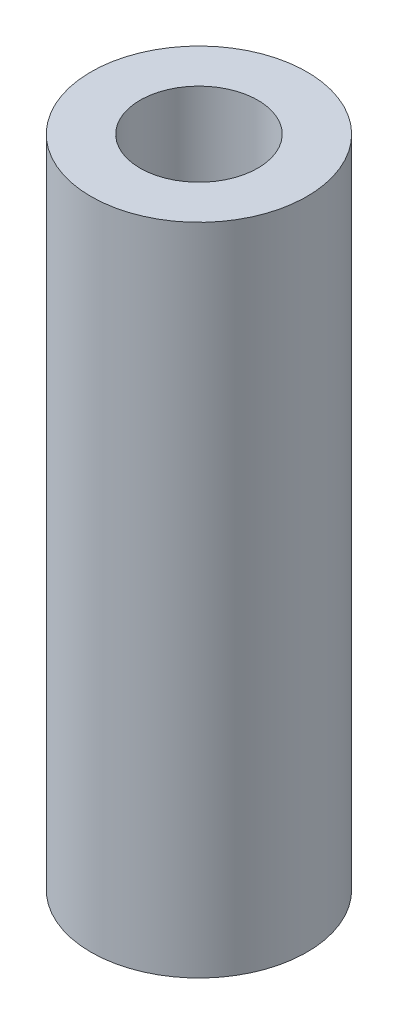
ISO-10303-21;
HEADER;
FILE_DESCRIPTION(('STEP AP214'),'2;1');
FILE_NAME('part.step','',(''),(''),'','','');
FILE_SCHEMA(('AUTOMOTIVE_DESIGN { 1 0 10303 214 1 1 1 1 }'));
ENDSEC;
DATA;
#1=APPLICATION_CONTEXT('core data for automotive mechanical design processes');
#2=APPLICATION_PROTOCOL_DEFINITION('international standard','automotive_design',2000,#1);
#3=PRODUCT_CONTEXT('',#1,'mechanical');
#4=PRODUCT('Part','Part','',(#3));
#5=PRODUCT_RELATED_PRODUCT_CATEGORY('part','',(#4));
#6=PRODUCT_DEFINITION_FORMATION('','',#4);
#7=PRODUCT_DEFINITION_CONTEXT('part definition',#1,'design');
#8=PRODUCT_DEFINITION('design','',#6,#7);
#9=PRODUCT_DEFINITION_SHAPE('','',#8);
#10=(LENGTH_UNIT() NAMED_UNIT(*) SI_UNIT(.MILLI.,.METRE.));
#11=(NAMED_UNIT(*) PLANE_ANGLE_UNIT() SI_UNIT($,.RADIAN.));
#12=(NAMED_UNIT(*) SI_UNIT($,.STERADIAN.) SOLID_ANGLE_UNIT());
#13=UNCERTAINTY_MEASURE_WITH_UNIT(LENGTH_MEASURE(1.E-05),#10,'distance_accuracy_value','');
#14=(GEOMETRIC_REPRESENTATION_CONTEXT(3) GLOBAL_UNCERTAINTY_ASSIGNED_CONTEXT((#13)) GLOBAL_UNIT_ASSIGNED_CONTEXT((#10,
#11,#12)) REPRESENTATION_CONTEXT('',''));
#15=CARTESIAN_POINT('',(0.,0.,0.));
#16=DIRECTION('',(0.,0.,1.));
#17=DIRECTION('',(1.,0.,0.));
#18=AXIS2_PLACEMENT_3D('',#15,#16,#17);
#19=CARTESIAN_POINT('',(0.,20.,0.));
#20=DIRECTION('',(0.,1.,0.));
#21=DIRECTION('',(0.,0.,1.));
#22=AXIS2_PLACEMENT_3D('',#19,#20,#21);
#23=PLANE('',#22);
#24=CARTESIAN_POINT('',(0.,20.,0.));
#25=DIRECTION('',(0.,1.,0.));
#26=DIRECTION('',(0.,0.,1.));
#27=AXIS2_PLACEMENT_3D('',#24,#25,#26);
#28=CIRCLE('',#27,3.3);
#29=CARTESIAN_POINT('',(0.,20.,3.3));
#30=VERTEX_POINT('',#29);
#31=EDGE_CURVE('E10',#30,#30,#28,.T.);
#32=ORIENTED_EDGE('',*,*,#31,.T.);
#33=EDGE_LOOP('',(#32));
#34=FACE_BOUND('',#33,.T.);
#35=CARTESIAN_POINT('',(0.,20.,0.));
#36=DIRECTION('',(0.,1.,0.));
#37=DIRECTION('',(0.,0.,1.));
#38=AXIS2_PLACEMENT_3D('',#35,#36,#37);
#39=CIRCLE('',#38,1.8);
#40=CARTESIAN_POINT('',(0.,20.,1.8));
#41=VERTEX_POINT('',#40);
#42=EDGE_CURVE('E48',#41,#41,#39,.T.);
#43=ORIENTED_EDGE('',*,*,#42,.F.);
#44=EDGE_LOOP('',(#43));
#45=FACE_BOUND('',#44,.T.);
#46=ADVANCED_FACE('F37',(#34,#45),#23,.T.);
#47=CARTESIAN_POINT('',(0.,0.,0.));
#48=DIRECTION('',(0.,1.,0.));
#49=DIRECTION('',(0.,0.,1.));
#50=AXIS2_PLACEMENT_3D('',#47,#48,#49);
#51=PLANE('',#50);
#52=CARTESIAN_POINT('',(0.,0.,0.));
#53=DIRECTION('',(0.,1.,0.));
#54=DIRECTION('',(0.,0.,1.));
#55=AXIS2_PLACEMENT_3D('',#52,#53,#54);
#56=CIRCLE('',#55,3.3);
#57=CARTESIAN_POINT('',(0.,0.,3.3));
#58=VERTEX_POINT('',#57);
#59=EDGE_CURVE('E41',#58,#58,#56,.T.);
#60=ORIENTED_EDGE('',*,*,#59,.F.);
#61=EDGE_LOOP('',(#60));
#62=FACE_BOUND('',#61,.T.);
#63=CARTESIAN_POINT('',(0.,0.,0.));
#64=DIRECTION('',(0.,1.,0.));
#65=DIRECTION('',(0.,0.,1.));
#66=AXIS2_PLACEMENT_3D('',#63,#64,#65);
#67=CIRCLE('',#66,1.8);
#68=CARTESIAN_POINT('',(0.,0.,1.8));
#69=VERTEX_POINT('',#68);
#70=EDGE_CURVE('E50',#69,#69,#67,.T.);
#71=ORIENTED_EDGE('',*,*,#70,.T.);
#72=EDGE_LOOP('',(#71));
#73=FACE_BOUND('',#72,.T.);
#74=ADVANCED_FACE('F60',(#62,#73),#51,.F.);
#75=CARTESIAN_POINT('',(0.,20.,0.));
#76=DIRECTION('',(0.,-1.,0.));
#77=DIRECTION('',(0.,0.,-1.));
#78=AXIS2_PLACEMENT_3D('',#75,#76,#77);
#79=CYLINDRICAL_SURFACE('',#78,3.3);
#80=ORIENTED_EDGE('',*,*,#31,.F.);
#81=EDGE_LOOP('',(#80));
#82=FACE_BOUND('',#81,.T.);
#83=ORIENTED_EDGE('',*,*,#59,.T.);
#84=EDGE_LOOP('',(#83));
#85=FACE_BOUND('',#84,.T.);
#86=ADVANCED_FACE('F39',(#82,#85),#79,.T.);
#87=CARTESIAN_POINT('',(0.,20.,0.));
#88=DIRECTION('',(0.,-1.,0.));
#89=DIRECTION('',(0.,0.,-1.));
#90=AXIS2_PLACEMENT_3D('',#87,#88,#89);
#91=CYLINDRICAL_SURFACE('',#90,1.8);
#92=ORIENTED_EDGE('',*,*,#42,.T.);
#93=EDGE_LOOP('',(#92));
#94=FACE_BOUND('',#93,.T.);
#95=ORIENTED_EDGE('',*,*,#70,.F.);
#96=EDGE_LOOP('',(#95));
#97=FACE_BOUND('',#96,.T.);
#98=ADVANCED_FACE('F56',(#94,#97),#91,.F.);
#99=CLOSED_SHELL('',(#46,#74,#86,#98));
#100=MANIFOLD_SOLID_BREP('B2',#99);
#101=ADVANCED_BREP_SHAPE_REPRESENTATION('',(#18,#100),#14);
#102=SHAPE_DEFINITION_REPRESENTATION(#9,#101);
ENDSEC;
END-ISO-10303-21;
